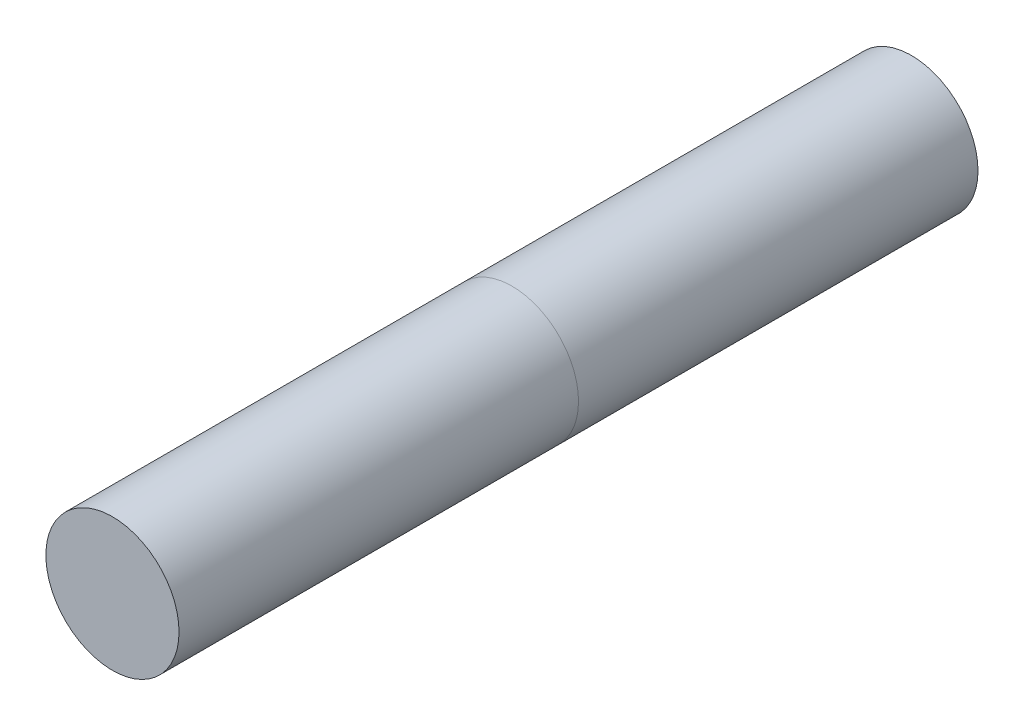
ISO-10303-21;
HEADER;
FILE_DESCRIPTION(('STEP AP214'),'2;1');
FILE_NAME('part.step','',(''),(''),'','','');
FILE_SCHEMA(('AUTOMOTIVE_DESIGN { 1 0 10303 214 1 1 1 1 }'));
ENDSEC;
DATA;
#1=APPLICATION_CONTEXT('core data for automotive mechanical design processes');
#2=APPLICATION_PROTOCOL_DEFINITION('international standard','automotive_design',2000,#1);
#3=PRODUCT_CONTEXT('',#1,'mechanical');
#4=PRODUCT('Part','Part','',(#3));
#5=PRODUCT_RELATED_PRODUCT_CATEGORY('part','',(#4));
#6=PRODUCT_DEFINITION_FORMATION('','',#4);
#7=PRODUCT_DEFINITION_CONTEXT('part definition',#1,'design');
#8=PRODUCT_DEFINITION('design','',#6,#7);
#9=PRODUCT_DEFINITION_SHAPE('','',#8);
#10=(LENGTH_UNIT() NAMED_UNIT(*) SI_UNIT(.MILLI.,.METRE.));
#11=(NAMED_UNIT(*) PLANE_ANGLE_UNIT() SI_UNIT($,.RADIAN.));
#12=(NAMED_UNIT(*) SI_UNIT($,.STERADIAN.) SOLID_ANGLE_UNIT());
#13=UNCERTAINTY_MEASURE_WITH_UNIT(LENGTH_MEASURE(1.E-05),#10,'distance_accuracy_value','');
#14=(GEOMETRIC_REPRESENTATION_CONTEXT(3) GLOBAL_UNCERTAINTY_ASSIGNED_CONTEXT((#13)) GLOBAL_UNIT_ASSIGNED_CONTEXT((#10,
#11,#12)) REPRESENTATION_CONTEXT('',''));
#15=CARTESIAN_POINT('',(0.,0.,0.));
#16=DIRECTION('',(0.,0.,1.));
#17=DIRECTION('',(1.,0.,0.));
#18=AXIS2_PLACEMENT_3D('',#15,#16,#17);
#19=CARTESIAN_POINT('',(0.,0.,30.));
#20=DIRECTION('',(0.,0.,-1.));
#21=DIRECTION('',(-1.,0.,0.));
#22=AXIS2_PLACEMENT_3D('',#19,#20,#21);
#23=CYLINDRICAL_SURFACE('',#22,2.5);
#24=CARTESIAN_POINT('',(0.,0.,30.));
#25=DIRECTION('',(0.,0.,1.));
#26=DIRECTION('',(1.,0.,0.));
#27=AXIS2_PLACEMENT_3D('',#24,#25,#26);
#28=CIRCLE('',#27,2.5);
#29=CARTESIAN_POINT('',(2.5,0.,30.));
#30=VERTEX_POINT('',#29);
#31=EDGE_CURVE('E11',#30,#30,#28,.T.);
#32=ORIENTED_EDGE('',*,*,#31,.F.);
#33=EDGE_LOOP('',(#32));
#34=FACE_BOUND('',#33,.T.);
#35=CARTESIAN_POINT('',(0.,0.,15.));
#36=DIRECTION('',(0.,0.,1.));
#37=DIRECTION('',(1.,0.,0.));
#38=AXIS2_PLACEMENT_3D('',#35,#36,#37);
#39=CIRCLE('',#38,2.5);
#40=CARTESIAN_POINT('',(2.5,0.,15.));
#41=VERTEX_POINT('',#40);
#42=EDGE_CURVE('E54',#41,#41,#39,.T.);
#43=ORIENTED_EDGE('',*,*,#42,.T.);
#44=EDGE_LOOP('',(#43));
#45=FACE_BOUND('',#44,.T.);
#46=ADVANCED_FACE('F51',(#34,#45),#23,.T.);
#47=CARTESIAN_POINT('',(0.,0.,30.));
#48=DIRECTION('',(0.,0.,1.));
#49=DIRECTION('',(1.,0.,0.));
#50=AXIS2_PLACEMENT_3D('',#47,#48,#49);
#51=PLANE('',#50);
#52=ORIENTED_EDGE('',*,*,#31,.T.);
#53=EDGE_LOOP('',(#52));
#54=FACE_BOUND('',#53,.T.);
#55=ADVANCED_FACE('F68',(#54),#51,.T.);
#56=CARTESIAN_POINT('',(0.,0.,15.));
#57=DIRECTION('',(0.,0.,1.));
#58=DIRECTION('',(1.,0.,0.));
#59=AXIS2_PLACEMENT_3D('',#56,#57,#58);
#60=PLANE('',#59);
#61=ORIENTED_EDGE('',*,*,#42,.F.);
#62=EDGE_LOOP('',(#61));
#63=FACE_BOUND('',#62,.T.);
#64=ADVANCED_FACE('F66',(#63),#60,.F.);
#65=CLOSED_SHELL('',(#46,#55,#64));
#66=MANIFOLD_SOLID_BREP('B2',#65);
#67=CARTESIAN_POINT('',(0.,0.,15.));
#68=DIRECTION('',(0.,0.,-1.));
#69=DIRECTION('',(-1.,0.,0.));
#70=AXIS2_PLACEMENT_3D('',#67,#68,#69);
#71=CYLINDRICAL_SURFACE('',#70,2.5);
#72=CARTESIAN_POINT('',(0.,0.,15.));
#73=DIRECTION('',(0.,0.,1.));
#74=DIRECTION('',(1.,0.,0.));
#75=AXIS2_PLACEMENT_3D('',#72,#73,#74);
#76=CIRCLE('',#75,2.5);
#77=CARTESIAN_POINT('',(2.5,0.,15.));
#78=VERTEX_POINT('',#77);
#79=EDGE_CURVE('E50',#78,#78,#76,.T.);
#80=ORIENTED_EDGE('',*,*,#79,.F.);
#81=EDGE_LOOP('',(#80));
#82=FACE_BOUND('',#81,.T.);
#83=CARTESIAN_POINT('',(0.,0.,0.));
#84=DIRECTION('',(0.,0.,1.));
#85=DIRECTION('',(1.,0.,0.));
#86=AXIS2_PLACEMENT_3D('',#83,#84,#85);
#87=CIRCLE('',#86,2.5);
#88=CARTESIAN_POINT('',(2.5,0.,0.));
#89=VERTEX_POINT('',#88);
#90=EDGE_CURVE('E97',#89,#89,#87,.T.);
#91=ORIENTED_EDGE('',*,*,#90,.T.);
#92=EDGE_LOOP('',(#91));
#93=FACE_BOUND('',#92,.T.);
#94=ADVANCED_FACE('F94',(#82,#93),#71,.T.);
#95=CARTESIAN_POINT('',(0.,0.,15.));
#96=DIRECTION('',(0.,0.,1.));
#97=DIRECTION('',(1.,0.,0.));
#98=AXIS2_PLACEMENT_3D('',#95,#96,#97);
#99=PLANE('',#98);
#100=ORIENTED_EDGE('',*,*,#79,.T.);
#101=EDGE_LOOP('',(#100));
#102=FACE_BOUND('',#101,.T.);
#103=ADVANCED_FACE('F109',(#102),#99,.T.);
#104=CARTESIAN_POINT('',(0.,0.,0.));
#105=DIRECTION('',(0.,0.,1.));
#106=DIRECTION('',(1.,0.,0.));
#107=AXIS2_PLACEMENT_3D('',#104,#105,#106);
#108=PLANE('',#107);
#109=ORIENTED_EDGE('',*,*,#90,.F.);
#110=EDGE_LOOP('',(#109));
#111=FACE_BOUND('',#110,.T.);
#112=ADVANCED_FACE('F107',(#111),#108,.F.);
#113=CLOSED_SHELL('',(#94,#103,#112));
#114=MANIFOLD_SOLID_BREP('B6',#113);
#115=ADVANCED_BREP_SHAPE_REPRESENTATION('',(#18,#66,#114),#14);
#116=SHAPE_DEFINITION_REPRESENTATION(#9,#115);
ENDSEC;
END-ISO-10303-21;
